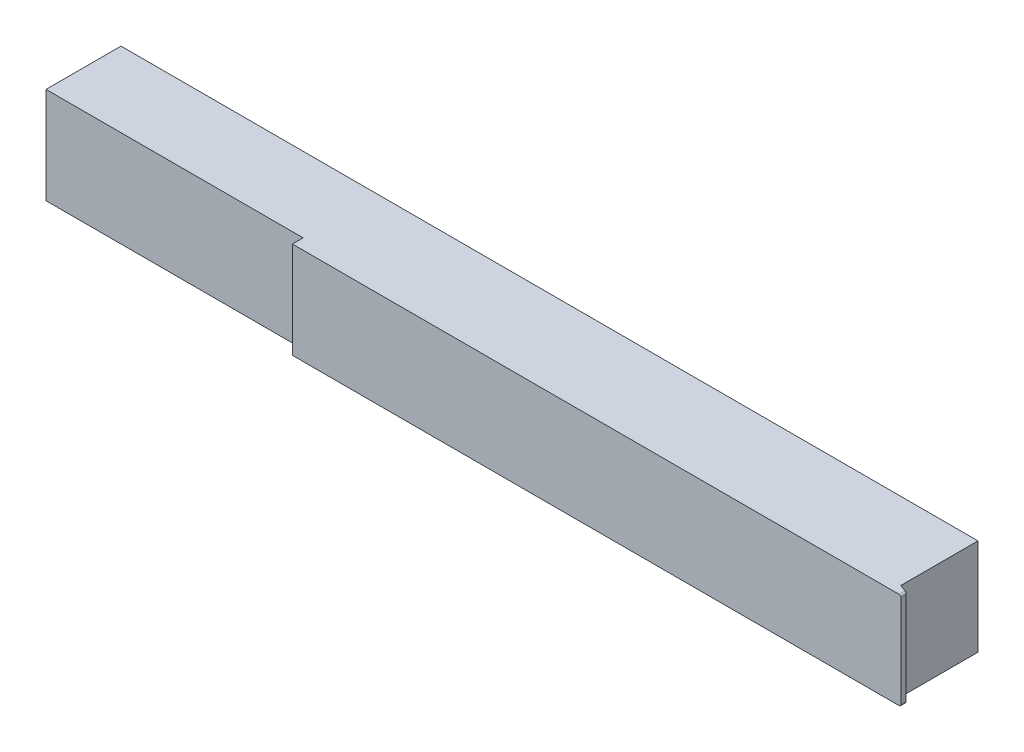
ISO-10303-21;
HEADER;
FILE_DESCRIPTION(('STEP AP214'),'2;1');
FILE_NAME('part.step','',(''),(''),'','','');
FILE_SCHEMA(('AUTOMOTIVE_DESIGN { 1 0 10303 214 1 1 1 1 }'));
ENDSEC;
DATA;
#1=APPLICATION_CONTEXT('core data for automotive mechanical design processes');
#2=APPLICATION_PROTOCOL_DEFINITION('international standard','automotive_design',2000,#1);
#3=PRODUCT_CONTEXT('',#1,'mechanical');
#4=PRODUCT('Part','Part','',(#3));
#5=PRODUCT_RELATED_PRODUCT_CATEGORY('part','',(#4));
#6=PRODUCT_DEFINITION_FORMATION('','',#4);
#7=PRODUCT_DEFINITION_CONTEXT('part definition',#1,'design');
#8=PRODUCT_DEFINITION('design','',#6,#7);
#9=PRODUCT_DEFINITION_SHAPE('','',#8);
#10=(LENGTH_UNIT() NAMED_UNIT(*) SI_UNIT(.MILLI.,.METRE.));
#11=(NAMED_UNIT(*) PLANE_ANGLE_UNIT() SI_UNIT($,.RADIAN.));
#12=(NAMED_UNIT(*) SI_UNIT($,.STERADIAN.) SOLID_ANGLE_UNIT());
#13=UNCERTAINTY_MEASURE_WITH_UNIT(LENGTH_MEASURE(1.E-05),#10,'distance_accuracy_value','');
#14=(GEOMETRIC_REPRESENTATION_CONTEXT(3) GLOBAL_UNCERTAINTY_ASSIGNED_CONTEXT((#13)) GLOBAL_UNIT_ASSIGNED_CONTEXT((#10,
#11,#12)) REPRESENTATION_CONTEXT('',''));
#15=CARTESIAN_POINT('',(0.,0.,0.));
#16=DIRECTION('',(0.,0.,1.));
#17=DIRECTION('',(1.,0.,0.));
#18=AXIS2_PLACEMENT_3D('',#15,#16,#17);
#19=CARTESIAN_POINT('',(0.,0.,-20.));
#20=DIRECTION('',(1.,0.,0.));
#21=DIRECTION('',(0.,0.,-1.));
#22=AXIS2_PLACEMENT_3D('',#19,#20,#21);
#23=PLANE('',#22);
#24=DIRECTION('',(0.,0.,1.));
#25=VECTOR('',#24,1.);
#26=CARTESIAN_POINT('',(0.,15.25,-20.));
#27=LINE('',#26,#25);
#28=CARTESIAN_POINT('',(0.,15.25,-20.));
#29=VERTEX_POINT('',#28);
#30=CARTESIAN_POINT('',(0.,15.25,-8.));
#31=VERTEX_POINT('',#30);
#32=EDGE_CURVE('E222',#29,#31,#27,.T.);
#33=ORIENTED_EDGE('',*,*,#32,.T.);
#34=DIRECTION('',(0.,-1.,0.));
#35=VECTOR('',#34,1.);
#36=CARTESIAN_POINT('',(0.,15.25,-8.));
#37=LINE('',#36,#35);
#38=CARTESIAN_POINT('',(0.,7.25,-8.));
#39=VERTEX_POINT('',#38);
#40=EDGE_CURVE('E190',#31,#39,#37,.T.);
#41=ORIENTED_EDGE('',*,*,#40,.T.);
#42=DIRECTION('',(0.,0.,1.));
#43=VECTOR('',#42,1.);
#44=CARTESIAN_POINT('',(0.,7.25,-20.));
#45=LINE('',#44,#43);
#46=CARTESIAN_POINT('',(0.,7.25,-20.));
#47=VERTEX_POINT('',#46);
#48=EDGE_CURVE('E201',#47,#39,#45,.T.);
#49=ORIENTED_EDGE('',*,*,#48,.F.);
#50=DIRECTION('',(0.,1.,0.));
#51=VECTOR('',#50,1.);
#52=CARTESIAN_POINT('',(0.,0.,-20.));
#53=LINE('',#52,#51);
#54=CARTESIAN_POINT('',(0.,0.,-20.));
#55=VERTEX_POINT('',#54);
#56=EDGE_CURVE('E264',#55,#47,#53,.T.);
#57=ORIENTED_EDGE('',*,*,#56,.F.);
#58=DIRECTION('',(0.,0.,1.));
#59=VECTOR('',#58,1.);
#60=CARTESIAN_POINT('',(0.,0.,-20.));
#61=LINE('',#60,#59);
#62=CARTESIAN_POINT('',(0.,0.,-2.5));
#63=VERTEX_POINT('',#62);
#64=EDGE_CURVE('E277',#55,#63,#61,.T.);
#65=ORIENTED_EDGE('',*,*,#64,.T.);
#66=DIRECTION('',(0.,1.,0.));
#67=VECTOR('',#66,1.);
#68=CARTESIAN_POINT('',(0.,-60.0520607473216,-2.5));
#69=LINE('',#68,#67);
#70=CARTESIAN_POINT('',(0.,22.5,-2.5));
#71=VERTEX_POINT('',#70);
#72=EDGE_CURVE('E244',#63,#71,#69,.T.);
#73=ORIENTED_EDGE('',*,*,#72,.T.);
#74=DIRECTION('',(0.,0.,1.));
#75=VECTOR('',#74,1.);
#76=CARTESIAN_POINT('',(0.,22.5,-20.));
#77=LINE('',#76,#75);
#78=CARTESIAN_POINT('',(0.,22.5,-20.));
#79=VERTEX_POINT('',#78);
#80=EDGE_CURVE('E290',#79,#71,#77,.T.);
#81=ORIENTED_EDGE('',*,*,#80,.F.);
#82=EDGE_CURVE('E269',#29,#79,#53,.T.);
#83=ORIENTED_EDGE('',*,*,#82,.F.);
#84=EDGE_LOOP('',(#33,#41,#49,#57,#65,#73,#81,#83));
#85=FACE_BOUND('',#84,.T.);
#86=ADVANCED_FACE('F79',(#85),#23,.F.);
#87=CARTESIAN_POINT('',(0.,0.,-20.));
#88=DIRECTION('',(0.,0.,-1.));
#89=DIRECTION('',(-1.,0.,0.));
#90=AXIS2_PLACEMENT_3D('',#87,#88,#89);
#91=PLANE('',#90);
#92=DIRECTION('',(0.,-1.,0.));
#93=VECTOR('',#92,1.);
#94=CARTESIAN_POINT('',(80.,15.25,-20.));
#95=LINE('',#94,#93);
#96=CARTESIAN_POINT('',(80.,15.25,-20.));
#97=VERTEX_POINT('',#96);
#98=CARTESIAN_POINT('',(80.,7.25000000000001,-20.));
#99=VERTEX_POINT('',#98);
#100=EDGE_CURVE('E191',#97,#99,#95,.T.);
#101=ORIENTED_EDGE('',*,*,#100,.F.);
#102=DIRECTION('',(1.,0.,0.));
#103=VECTOR('',#102,1.);
#104=CARTESIAN_POINT('',(0.,15.25,-20.));
#105=LINE('',#104,#103);
#106=EDGE_CURVE('E213',#29,#97,#105,.T.);
#107=ORIENTED_EDGE('',*,*,#106,.F.);
#108=ORIENTED_EDGE('',*,*,#82,.T.);
#109=DIRECTION('',(1.,0.,0.));
#110=VECTOR('',#109,1.);
#111=CARTESIAN_POINT('',(0.,22.5,-20.));
#112=LINE('',#111,#110);
#113=CARTESIAN_POINT('',(200.,22.5,-20.));
#114=VERTEX_POINT('',#113);
#115=EDGE_CURVE('E268',#79,#114,#112,.T.);
#116=ORIENTED_EDGE('',*,*,#115,.T.);
#117=DIRECTION('',(0.,1.,0.));
#118=VECTOR('',#117,1.);
#119=CARTESIAN_POINT('',(200.,0.,-20.));
#120=LINE('',#119,#118);
#121=CARTESIAN_POINT('',(200.,0.,-20.));
#122=VERTEX_POINT('',#121);
#123=EDGE_CURVE('E260',#122,#114,#120,.T.);
#124=ORIENTED_EDGE('',*,*,#123,.F.);
#125=DIRECTION('',(1.,0.,0.));
#126=VECTOR('',#125,1.);
#127=CARTESIAN_POINT('',(0.,0.,-20.));
#128=LINE('',#127,#126);
#129=EDGE_CURVE('E273',#55,#122,#128,.T.);
#130=ORIENTED_EDGE('',*,*,#129,.F.);
#131=ORIENTED_EDGE('',*,*,#56,.T.);
#132=DIRECTION('',(1.,0.,0.));
#133=VECTOR('',#132,1.);
#134=CARTESIAN_POINT('',(0.,7.25,-20.));
#135=LINE('',#134,#133);
#136=EDGE_CURVE('E197',#47,#99,#135,.T.);
#137=ORIENTED_EDGE('',*,*,#136,.T.);
#138=EDGE_LOOP('',(#101,#107,#108,#116,#124,#130,#131,#137));
#139=FACE_BOUND('',#138,.T.);
#140=ADVANCED_FACE('F367',(#139),#91,.T.);
#141=CARTESIAN_POINT('',(0.,22.5,-20.));
#142=DIRECTION('',(0.,-1.,0.));
#143=DIRECTION('',(1.,0.,0.));
#144=AXIS2_PLACEMENT_3D('',#141,#142,#143);
#145=PLANE('',#144);
#146=DIRECTION('',(-1.,0.,0.));
#147=VECTOR('',#146,1.);
#148=CARTESIAN_POINT('',(60.,22.5,-2.5));
#149=LINE('',#148,#147);
#150=CARTESIAN_POINT('',(60.,22.5,-2.5));
#151=VERTEX_POINT('',#150);
#152=EDGE_CURVE('E234',#151,#71,#149,.T.);
#153=ORIENTED_EDGE('',*,*,#152,.F.);
#154=DIRECTION('',(0.,0.,-1.));
#155=VECTOR('',#154,1.);
#156=CARTESIAN_POINT('',(60.,22.5,0.));
#157=LINE('',#156,#155);
#158=CARTESIAN_POINT('',(60.,22.5,0.));
#159=VERTEX_POINT('',#158);
#160=EDGE_CURVE('E227',#159,#151,#157,.T.);
#161=ORIENTED_EDGE('',*,*,#160,.F.);
#162=DIRECTION('',(1.,0.,0.));
#163=VECTOR('',#162,1.);
#164=CARTESIAN_POINT('',(0.,22.5,0.));
#165=LINE('',#164,#163);
#166=CARTESIAN_POINT('',(201.6,22.5,0.));
#167=VERTEX_POINT('',#166);
#168=EDGE_CURVE('E263',#159,#167,#165,.T.);
#169=ORIENTED_EDGE('',*,*,#168,.T.);
#170=DIRECTION('',(0.,0.,1.));
#171=VECTOR('',#170,1.);
#172=CARTESIAN_POINT('',(201.6,22.5,-1.24999999999999));
#173=LINE('',#172,#171);
#174=CARTESIAN_POINT('',(201.6,22.5,-1.39558809370647));
#175=VERTEX_POINT('',#174);
#176=EDGE_CURVE('E12',#167,#175,#173,.F.);
#177=ORIENTED_EDGE('',*,*,#176,.T.);
#178=DIRECTION('',(0.939692620785909,0.,0.342020143325667));
#179=VECTOR('',#178,1.);
#180=CARTESIAN_POINT('',(202.,22.5,-1.24999999999999));
#181=LINE('',#180,#179);
#182=CARTESIAN_POINT('',(200.,22.5,-1.97794046853239));
#183=VERTEX_POINT('',#182);
#184=EDGE_CURVE('E298',#175,#183,#181,.F.);
#185=ORIENTED_EDGE('',*,*,#184,.T.);
#186=DIRECTION('',(0.,0.,1.));
#187=VECTOR('',#186,1.);
#188=CARTESIAN_POINT('',(200.,22.5,-20.));
#189=LINE('',#188,#187);
#190=EDGE_CURVE('E256',#114,#183,#189,.T.);
#191=ORIENTED_EDGE('',*,*,#190,.F.);
#192=ORIENTED_EDGE('',*,*,#115,.F.);
#193=ORIENTED_EDGE('',*,*,#80,.T.);
#194=EDGE_LOOP('',(#153,#161,#169,#177,#185,#191,#192,#193));
#195=FACE_BOUND('',#194,.T.);
#196=ADVANCED_FACE('F357',(#195),#145,.F.);
#197=CARTESIAN_POINT('',(202.,0.,-20.));
#198=DIRECTION('',(1.,0.,0.));
#199=DIRECTION('',(0.,0.,-1.));
#200=AXIS2_PLACEMENT_3D('',#197,#198,#199);
#201=PLANE('',#200);
#202=DIRECTION('',(0.,1.,0.));
#203=VECTOR('',#202,1.);
#204=CARTESIAN_POINT('',(202.,0.,0.));
#205=LINE('',#204,#203);
#206=CARTESIAN_POINT('',(202.,0.400000000000025,0.));
#207=VERTEX_POINT('',#206);
#208=CARTESIAN_POINT('',(202.,22.1,0.));
#209=VERTEX_POINT('',#208);
#210=EDGE_CURVE('E280',#207,#209,#205,.T.);
#211=ORIENTED_EDGE('',*,*,#210,.F.);
#212=DIRECTION('',(0.,0.,1.));
#213=VECTOR('',#212,1.);
#214=CARTESIAN_POINT('',(202.,0.400000000000025,-20.));
#215=LINE('',#214,#213);
#216=CARTESIAN_POINT('',(202.,0.400000000000025,-1.24999999999999));
#217=VERTEX_POINT('',#216);
#218=EDGE_CURVE('E324',#207,#217,#215,.F.);
#219=ORIENTED_EDGE('',*,*,#218,.T.);
#220=DIRECTION('',(0.,1.,0.));
#221=VECTOR('',#220,1.);
#222=CARTESIAN_POINT('',(202.,0.,-1.24999999999999));
#223=LINE('',#222,#221);
#224=CARTESIAN_POINT('',(202.,22.1,-1.24999999999999));
#225=VERTEX_POINT('',#224);
#226=EDGE_CURVE('E294',#217,#225,#223,.T.);
#227=ORIENTED_EDGE('',*,*,#226,.T.);
#228=DIRECTION('',(0.,0.,1.));
#229=VECTOR('',#228,1.);
#230=CARTESIAN_POINT('',(202.,22.1,0.));
#231=LINE('',#230,#229);
#232=EDGE_CURVE('E320',#225,#209,#231,.T.);
#233=ORIENTED_EDGE('',*,*,#232,.T.);
#234=EDGE_LOOP('',(#211,#219,#227,#233));
#235=FACE_BOUND('',#234,.T.);
#236=ADVANCED_FACE('F349',(#235),#201,.T.);
#237=CARTESIAN_POINT('',(0.,0.,-20.));
#238=DIRECTION('',(0.,-1.,0.));
#239=DIRECTION('',(1.,0.,0.));
#240=AXIS2_PLACEMENT_3D('',#237,#238,#239);
#241=PLANE('',#240);
#242=DIRECTION('',(0.,0.,-1.));
#243=VECTOR('',#242,1.);
#244=CARTESIAN_POINT('',(60.,0.,0.));
#245=LINE('',#244,#243);
#246=CARTESIAN_POINT('',(60.,0.,0.));
#247=VERTEX_POINT('',#246);
#248=CARTESIAN_POINT('',(60.,0.,-2.5));
#249=VERTEX_POINT('',#248);
#250=EDGE_CURVE('E103',#247,#249,#245,.T.);
#251=ORIENTED_EDGE('',*,*,#250,.T.);
#252=DIRECTION('',(-1.,0.,0.));
#253=VECTOR('',#252,1.);
#254=CARTESIAN_POINT('',(60.,0.,-2.5));
#255=LINE('',#254,#253);
#256=EDGE_CURVE('E240',#249,#63,#255,.T.);
#257=ORIENTED_EDGE('',*,*,#256,.T.);
#258=ORIENTED_EDGE('',*,*,#64,.F.);
#259=ORIENTED_EDGE('',*,*,#129,.T.);
#260=DIRECTION('',(0.,0.,1.));
#261=VECTOR('',#260,1.);
#262=CARTESIAN_POINT('',(200.,0.,-20.));
#263=LINE('',#262,#261);
#264=CARTESIAN_POINT('',(200.,0.,-1.97794046853239));
#265=VERTEX_POINT('',#264);
#266=EDGE_CURVE('E253',#122,#265,#263,.T.);
#267=ORIENTED_EDGE('',*,*,#266,.T.);
#268=DIRECTION('',(-0.939692620785909,0.,-0.342020143325667));
#269=VECTOR('',#268,1.);
#270=CARTESIAN_POINT('',(17.6033774041717,0.,-68.3648819240997));
#271=LINE('',#270,#269);
#272=CARTESIAN_POINT('',(201.6,0.,-1.39558809370649));
#273=VERTEX_POINT('',#272);
#274=EDGE_CURVE('E301',#265,#273,#271,.F.);
#275=ORIENTED_EDGE('',*,*,#274,.T.);
#276=DIRECTION('',(0.,0.,1.));
#277=VECTOR('',#276,1.);
#278=CARTESIAN_POINT('',(201.6,0.,-20.));
#279=LINE('',#278,#277);
#280=CARTESIAN_POINT('',(201.6,0.,0.));
#281=VERTEX_POINT('',#280);
#282=EDGE_CURVE('E309',#273,#281,#279,.T.);
#283=ORIENTED_EDGE('',*,*,#282,.T.);
#284=DIRECTION('',(1.,0.,0.));
#285=VECTOR('',#284,1.);
#286=CARTESIAN_POINT('',(0.,0.,0.));
#287=LINE('',#286,#285);
#288=EDGE_CURVE('E284',#247,#281,#287,.T.);
#289=ORIENTED_EDGE('',*,*,#288,.F.);
#290=EDGE_LOOP('',(#251,#257,#258,#259,#267,#275,#283,#289));
#291=FACE_BOUND('',#290,.T.);
#292=ADVANCED_FACE('F340',(#291),#241,.T.);
#293=CARTESIAN_POINT('',(0.,0.,0.));
#294=DIRECTION('',(0.,0.,-1.));
#295=DIRECTION('',(-1.,0.,0.));
#296=AXIS2_PLACEMENT_3D('',#293,#294,#295);
#297=PLANE('',#296);
#298=ORIENTED_EDGE('',*,*,#168,.F.);
#299=DIRECTION('',(0.,1.,0.));
#300=VECTOR('',#299,1.);
#301=CARTESIAN_POINT('',(60.,-60.0520607473216,0.));
#302=LINE('',#301,#300);
#303=EDGE_CURVE('E248',#247,#159,#302,.T.);
#304=ORIENTED_EDGE('',*,*,#303,.F.);
#305=ORIENTED_EDGE('',*,*,#288,.T.);
#306=CARTESIAN_POINT('',(201.6,0.400000000000025,0.));
#307=DIRECTION('',(0.,0.,-1.));
#308=DIRECTION('',(-1.,0.,0.));
#309=AXIS2_PLACEMENT_3D('',#306,#307,#308);
#310=CIRCLE('',#309,0.4);
#311=EDGE_CURVE('E317',#281,#207,#310,.F.);
#312=ORIENTED_EDGE('',*,*,#311,.T.);
#313=ORIENTED_EDGE('',*,*,#210,.T.);
#314=CARTESIAN_POINT('',(201.6,22.1,0.));
#315=DIRECTION('',(0.,0.,-1.));
#316=DIRECTION('',(-1.,0.,0.));
#317=AXIS2_PLACEMENT_3D('',#314,#315,#316);
#318=CIRCLE('',#317,0.4);
#319=EDGE_CURVE('E313',#209,#167,#318,.F.);
#320=ORIENTED_EDGE('',*,*,#319,.T.);
#321=EDGE_LOOP('',(#298,#304,#305,#312,#313,#320));
#322=FACE_BOUND('',#321,.T.);
#323=ADVANCED_FACE('F347',(#322),#297,.F.);
#324=CARTESIAN_POINT('',(200.,0.,0.));
#325=DIRECTION('',(-1.,0.,0.));
#326=DIRECTION('',(0.,0.,1.));
#327=AXIS2_PLACEMENT_3D('',#324,#325,#326);
#328=PLANE('',#327);
#329=ORIENTED_EDGE('',*,*,#266,.F.);
#330=ORIENTED_EDGE('',*,*,#123,.T.);
#331=ORIENTED_EDGE('',*,*,#190,.T.);
#332=DIRECTION('',(0.,1.,0.));
#333=VECTOR('',#332,1.);
#334=CARTESIAN_POINT('',(200.,0.,-1.97794046853239));
#335=LINE('',#334,#333);
#336=EDGE_CURVE('E305',#183,#265,#335,.F.);
#337=ORIENTED_EDGE('',*,*,#336,.T.);
#338=EDGE_LOOP('',(#329,#330,#331,#337));
#339=FACE_BOUND('',#338,.T.);
#340=ADVANCED_FACE('F371',(#339),#328,.F.);
#341=CARTESIAN_POINT('',(202.,0.,-1.24999999999999));
#342=DIRECTION('',(-0.342020143325667,0.,0.939692620785909));
#343=DIRECTION('',(0.,1.,0.));
#344=AXIS2_PLACEMENT_3D('',#341,#342,#343);
#345=PLANE('',#344);
#346=ORIENTED_EDGE('',*,*,#226,.F.);
#347=CARTESIAN_POINT('',(201.6,0.400000000000025,-1.39558809370647));
#348=DIRECTION('',(-0.342020143325667,0.,0.939692620785909));
#349=DIRECTION('',(0.939692620785909,0.,0.342020143325667));
#350=AXIS2_PLACEMENT_3D('',#347,#348,#349);
#351=ELLIPSE('',#350,0.425671108990365,0.4);
#352=EDGE_CURVE('E88',#217,#273,#351,.F.);
#353=ORIENTED_EDGE('',*,*,#352,.T.);
#354=ORIENTED_EDGE('',*,*,#274,.F.);
#355=ORIENTED_EDGE('',*,*,#336,.F.);
#356=ORIENTED_EDGE('',*,*,#184,.F.);
#357=CARTESIAN_POINT('',(201.6,22.1,-1.39558809370647));
#358=DIRECTION('',(-0.342020143325667,0.,0.939692620785909));
#359=DIRECTION('',(-0.939692620785909,0.,-0.342020143325667));
#360=AXIS2_PLACEMENT_3D('',#357,#358,#359);
#361=ELLIPSE('',#360,0.425671108990365,0.4);
#362=EDGE_CURVE('E327',#175,#225,#361,.F.);
#363=ORIENTED_EDGE('',*,*,#362,.T.);
#364=EDGE_LOOP('',(#346,#353,#354,#355,#356,#363));
#365=FACE_BOUND('',#364,.T.);
#366=ADVANCED_FACE('F334',(#365),#345,.F.);
#367=CARTESIAN_POINT('',(201.6,0.400000000000025,-20.));
#368=DIRECTION('',(0.,0.,1.));
#369=DIRECTION('',(1.,0.,0.));
#370=AXIS2_PLACEMENT_3D('',#367,#368,#369);
#371=CYLINDRICAL_SURFACE('',#370,0.4);
#372=ORIENTED_EDGE('',*,*,#352,.F.);
#373=ORIENTED_EDGE('',*,*,#218,.F.);
#374=ORIENTED_EDGE('',*,*,#311,.F.);
#375=ORIENTED_EDGE('',*,*,#282,.F.);
#376=EDGE_LOOP('',(#372,#373,#374,#375));
#377=FACE_BOUND('',#376,.T.);
#378=ADVANCED_FACE('F343',(#377),#371,.T.);
#379=CARTESIAN_POINT('',(201.6,22.1,-20.));
#380=DIRECTION('',(0.,0.,-1.));
#381=DIRECTION('',(-1.,0.,0.));
#382=AXIS2_PLACEMENT_3D('',#379,#380,#381);
#383=CYLINDRICAL_SURFACE('',#382,0.4);
#384=ORIENTED_EDGE('',*,*,#362,.F.);
#385=ORIENTED_EDGE('',*,*,#176,.F.);
#386=ORIENTED_EDGE('',*,*,#319,.F.);
#387=ORIENTED_EDGE('',*,*,#232,.F.);
#388=EDGE_LOOP('',(#384,#385,#386,#387));
#389=FACE_BOUND('',#388,.T.);
#390=ADVANCED_FACE('F81',(#389),#383,.T.);
#391=CARTESIAN_POINT('',(60.,-60.0520607473216,0.));
#392=DIRECTION('',(1.,0.,0.));
#393=DIRECTION('',(0.,1.,0.));
#394=AXIS2_PLACEMENT_3D('',#391,#392,#393);
#395=PLANE('',#394);
#396=ORIENTED_EDGE('',*,*,#303,.T.);
#397=ORIENTED_EDGE('',*,*,#160,.T.);
#398=DIRECTION('',(0.,1.,0.));
#399=VECTOR('',#398,1.);
#400=CARTESIAN_POINT('',(60.,-60.0520607473216,-2.5));
#401=LINE('',#400,#399);
#402=EDGE_CURVE('E239',#249,#151,#401,.T.);
#403=ORIENTED_EDGE('',*,*,#402,.F.);
#404=ORIENTED_EDGE('',*,*,#250,.F.);
#405=EDGE_LOOP('',(#396,#397,#403,#404));
#406=FACE_BOUND('',#405,.T.);
#407=ADVANCED_FACE('F359',(#406),#395,.F.);
#408=CARTESIAN_POINT('',(60.,-60.0520607473216,-2.5));
#409=DIRECTION('',(0.,0.,-1.));
#410=DIRECTION('',(-1.,0.,0.));
#411=AXIS2_PLACEMENT_3D('',#408,#409,#410);
#412=PLANE('',#411);
#413=ORIENTED_EDGE('',*,*,#402,.T.);
#414=ORIENTED_EDGE('',*,*,#152,.T.);
#415=ORIENTED_EDGE('',*,*,#72,.F.);
#416=ORIENTED_EDGE('',*,*,#256,.F.);
#417=EDGE_LOOP('',(#413,#414,#415,#416));
#418=FACE_BOUND('',#417,.T.);
#419=ADVANCED_FACE('F379',(#418),#412,.F.);
#420=CARTESIAN_POINT('',(0.,15.25,0.));
#421=DIRECTION('',(0.,-1.,0.));
#422=DIRECTION('',(1.,0.,0.));
#423=AXIS2_PLACEMENT_3D('',#420,#421,#422);
#424=PLANE('',#423);
#425=ORIENTED_EDGE('',*,*,#106,.T.);
#426=DIRECTION('',(0.,0.,1.));
#427=VECTOR('',#426,1.);
#428=CARTESIAN_POINT('',(80.,15.25,-20.));
#429=LINE('',#428,#427);
#430=CARTESIAN_POINT('',(80.,15.25,-8.));
#431=VERTEX_POINT('',#430);
#432=EDGE_CURVE('E217',#97,#431,#429,.T.);
#433=ORIENTED_EDGE('',*,*,#432,.T.);
#434=DIRECTION('',(1.,0.,0.));
#435=VECTOR('',#434,1.);
#436=CARTESIAN_POINT('',(0.,15.25,-8.));
#437=LINE('',#436,#435);
#438=EDGE_CURVE('E186',#31,#431,#437,.T.);
#439=ORIENTED_EDGE('',*,*,#438,.F.);
#440=ORIENTED_EDGE('',*,*,#32,.F.);
#441=EDGE_LOOP('',(#425,#433,#439,#440));
#442=FACE_BOUND('',#441,.T.);
#443=CARTESIAN_POINT('',(60.,15.25,-15.));
#444=DIRECTION('',(0.,1.,0.));
#445=DIRECTION('',(-1.,0.,0.));
#446=AXIS2_PLACEMENT_3D('',#443,#444,#445);
#447=CIRCLE('',#446,2.);
#448=CARTESIAN_POINT('',(58.,15.25,-15.));
#449=VERTEX_POINT('',#448);
#450=EDGE_CURVE('E206',#449,#449,#447,.T.);
#451=ORIENTED_EDGE('',*,*,#450,.T.);
#452=EDGE_LOOP('',(#451));
#453=FACE_BOUND('',#452,.T.);
#454=ADVANCED_FACE('F376',(#442,#453),#424,.T.);
#455=CARTESIAN_POINT('',(0.,15.25,-8.));
#456=DIRECTION('',(0.,0.,-1.));
#457=DIRECTION('',(-1.,0.,0.));
#458=AXIS2_PLACEMENT_3D('',#455,#456,#457);
#459=PLANE('',#458);
#460=ORIENTED_EDGE('',*,*,#40,.F.);
#461=ORIENTED_EDGE('',*,*,#438,.T.);
#462=DIRECTION('',(0.,-1.,0.));
#463=VECTOR('',#462,1.);
#464=CARTESIAN_POINT('',(80.,15.25,-8.));
#465=LINE('',#464,#463);
#466=CARTESIAN_POINT('',(80.,7.25000000000001,-8.));
#467=VERTEX_POINT('',#466);
#468=EDGE_CURVE('E181',#431,#467,#465,.T.);
#469=ORIENTED_EDGE('',*,*,#468,.T.);
#470=DIRECTION('',(1.,0.,0.));
#471=VECTOR('',#470,1.);
#472=CARTESIAN_POINT('',(0.,7.25,-8.));
#473=LINE('',#472,#471);
#474=EDGE_CURVE('E183',#39,#467,#473,.T.);
#475=ORIENTED_EDGE('',*,*,#474,.F.);
#476=EDGE_LOOP('',(#460,#461,#469,#475));
#477=FACE_BOUND('',#476,.T.);
#478=ADVANCED_FACE('F182',(#477),#459,.T.);
#479=CARTESIAN_POINT('',(80.,15.25,-20.));
#480=DIRECTION('',(1.,0.,0.));
#481=DIRECTION('',(0.,1.,0.));
#482=AXIS2_PLACEMENT_3D('',#479,#480,#481);
#483=PLANE('',#482);
#484=ORIENTED_EDGE('',*,*,#468,.F.);
#485=ORIENTED_EDGE('',*,*,#432,.F.);
#486=ORIENTED_EDGE('',*,*,#100,.T.);
#487=DIRECTION('',(0.,0.,1.));
#488=VECTOR('',#487,1.);
#489=CARTESIAN_POINT('',(80.,7.25000000000001,-20.));
#490=LINE('',#489,#488);
#491=EDGE_CURVE('E95',#99,#467,#490,.T.);
#492=ORIENTED_EDGE('',*,*,#491,.T.);
#493=EDGE_LOOP('',(#484,#485,#486,#492));
#494=FACE_BOUND('',#493,.T.);
#495=ADVANCED_FACE('F193',(#494),#483,.F.);
#496=CARTESIAN_POINT('',(60.,15.25,-15.));
#497=DIRECTION('',(0.,-1.,0.));
#498=DIRECTION('',(1.,0.,0.));
#499=AXIS2_PLACEMENT_3D('',#496,#497,#498);
#500=CYLINDRICAL_SURFACE('',#499,2.);
#501=ORIENTED_EDGE('',*,*,#450,.F.);
#502=EDGE_LOOP('',(#501));
#503=FACE_BOUND('',#502,.T.);
#504=CARTESIAN_POINT('',(60.,7.25000000000001,-15.));
#505=DIRECTION('',(0.,1.,0.));
#506=DIRECTION('',(-1.,0.,0.));
#507=AXIS2_PLACEMENT_3D('',#504,#505,#506);
#508=CIRCLE('',#507,2.);
#509=CARTESIAN_POINT('',(58.,7.25000000000001,-15.));
#510=VERTEX_POINT('',#509);
#511=EDGE_CURVE('E389',#510,#510,#508,.T.);
#512=ORIENTED_EDGE('',*,*,#511,.T.);
#513=EDGE_LOOP('',(#512));
#514=FACE_BOUND('',#513,.T.);
#515=ADVANCED_FACE('F383',(#503,#514),#500,.T.);
#516=CARTESIAN_POINT('',(0.,7.25,0.));
#517=DIRECTION('',(0.,-1.,0.));
#518=DIRECTION('',(1.,0.,0.));
#519=AXIS2_PLACEMENT_3D('',#516,#517,#518);
#520=PLANE('',#519);
#521=ORIENTED_EDGE('',*,*,#511,.F.);
#522=EDGE_LOOP('',(#521));
#523=FACE_BOUND('',#522,.T.);
#524=ORIENTED_EDGE('',*,*,#136,.F.);
#525=ORIENTED_EDGE('',*,*,#48,.T.);
#526=ORIENTED_EDGE('',*,*,#474,.T.);
#527=ORIENTED_EDGE('',*,*,#491,.F.);
#528=EDGE_LOOP('',(#524,#525,#526,#527));
#529=FACE_BOUND('',#528,.T.);
#530=ADVANCED_FACE('F199',(#523,#529),#520,.F.);
#531=CLOSED_SHELL('',(#86,#140,#196,#236,#292,#323,#340,#366,#378,#390,#407,#419,#454,#478,#495,
#515,#530));
#532=MANIFOLD_SOLID_BREP('B2',#531);
#533=ADVANCED_BREP_SHAPE_REPRESENTATION('',(#18,#532),#14);
#534=SHAPE_DEFINITION_REPRESENTATION(#9,#533);
ENDSEC;
END-ISO-10303-21;
